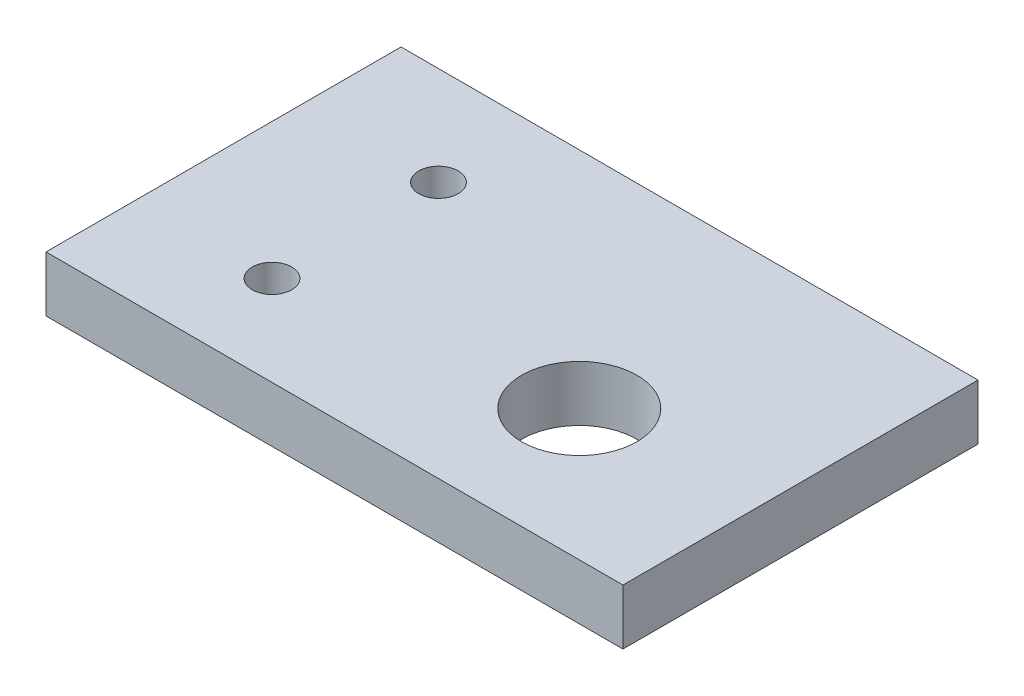
ISO-10303-21;
HEADER;
FILE_DESCRIPTION(('STEP AP214'),'2;1');
FILE_NAME('part.step','',(''),(''),'','','');
FILE_SCHEMA(('AUTOMOTIVE_DESIGN { 1 0 10303 214 1 1 1 1 }'));
ENDSEC;
DATA;
#1=APPLICATION_CONTEXT('core data for automotive mechanical design processes');
#2=APPLICATION_PROTOCOL_DEFINITION('international standard','automotive_design',2000,#1);
#3=PRODUCT_CONTEXT('',#1,'mechanical');
#4=PRODUCT('Part','Part','',(#3));
#5=PRODUCT_RELATED_PRODUCT_CATEGORY('part','',(#4));
#6=PRODUCT_DEFINITION_FORMATION('','',#4);
#7=PRODUCT_DEFINITION_CONTEXT('part definition',#1,'design');
#8=PRODUCT_DEFINITION('design','',#6,#7);
#9=PRODUCT_DEFINITION_SHAPE('','',#8);
#10=(LENGTH_UNIT() NAMED_UNIT(*) SI_UNIT(.MILLI.,.METRE.));
#11=(NAMED_UNIT(*) PLANE_ANGLE_UNIT() SI_UNIT($,.RADIAN.));
#12=(NAMED_UNIT(*) SI_UNIT($,.STERADIAN.) SOLID_ANGLE_UNIT());
#13=UNCERTAINTY_MEASURE_WITH_UNIT(LENGTH_MEASURE(1.E-05),#10,'distance_accuracy_value','');
#14=(GEOMETRIC_REPRESENTATION_CONTEXT(3) GLOBAL_UNCERTAINTY_ASSIGNED_CONTEXT((#13)) GLOBAL_UNIT_ASSIGNED_CONTEXT((#10,
#11,#12)) REPRESENTATION_CONTEXT('',''));
#15=CARTESIAN_POINT('',(0.,0.,0.));
#16=DIRECTION('',(0.,0.,1.));
#17=DIRECTION('',(1.,0.,0.));
#18=AXIS2_PLACEMENT_3D('',#15,#16,#17);
#19=CARTESIAN_POINT('',(0.,3.175,0.));
#20=DIRECTION('',(-1.,0.,0.));
#21=DIRECTION('',(0.,0.,1.));
#22=AXIS2_PLACEMENT_3D('',#19,#20,#21);
#23=PLANE('',#22);
#24=DIRECTION('',(0.,0.,-1.));
#25=VECTOR('',#24,1.);
#26=CARTESIAN_POINT('',(0.,0.,0.));
#27=LINE('',#26,#25);
#28=CARTESIAN_POINT('',(0.,0.,0.));
#29=VERTEX_POINT('',#28);
#30=CARTESIAN_POINT('',(0.,0.,-20.32));
#31=VERTEX_POINT('',#30);
#32=EDGE_CURVE('E105',#29,#31,#27,.T.);
#33=ORIENTED_EDGE('',*,*,#32,.F.);
#34=DIRECTION('',(0.,-1.,0.));
#35=VECTOR('',#34,1.);
#36=CARTESIAN_POINT('',(0.,3.175,0.));
#37=LINE('',#36,#35);
#38=CARTESIAN_POINT('',(0.,3.175,0.));
#39=VERTEX_POINT('',#38);
#40=EDGE_CURVE('E11',#39,#29,#37,.T.);
#41=ORIENTED_EDGE('',*,*,#40,.F.);
#42=DIRECTION('',(0.,0.,-1.));
#43=VECTOR('',#42,1.);
#44=CARTESIAN_POINT('',(0.,3.175,0.));
#45=LINE('',#44,#43);
#46=CARTESIAN_POINT('',(0.,3.175,-20.32));
#47=VERTEX_POINT('',#46);
#48=EDGE_CURVE('E89',#39,#47,#45,.T.);
#49=ORIENTED_EDGE('',*,*,#48,.T.);
#50=DIRECTION('',(0.,-1.,0.));
#51=VECTOR('',#50,1.);
#52=CARTESIAN_POINT('',(0.,3.175,-20.32));
#53=LINE('',#52,#51);
#54=EDGE_CURVE('E51',#47,#31,#53,.T.);
#55=ORIENTED_EDGE('',*,*,#54,.T.);
#56=EDGE_LOOP('',(#33,#41,#49,#55));
#57=FACE_BOUND('',#56,.T.);
#58=ADVANCED_FACE('F34',(#57),#23,.T.);
#59=CARTESIAN_POINT('',(0.,3.175,0.));
#60=DIRECTION('',(0.,0.,-1.));
#61=DIRECTION('',(-1.,0.,0.));
#62=AXIS2_PLACEMENT_3D('',#59,#60,#61);
#63=PLANE('',#62);
#64=DIRECTION('',(1.,0.,0.));
#65=VECTOR('',#64,1.);
#66=CARTESIAN_POINT('',(0.,0.,0.));
#67=LINE('',#66,#65);
#68=CARTESIAN_POINT('',(33.02,0.,0.));
#69=VERTEX_POINT('',#68);
#70=EDGE_CURVE('E94',#29,#69,#67,.T.);
#71=ORIENTED_EDGE('',*,*,#70,.T.);
#72=DIRECTION('',(0.,-1.,0.));
#73=VECTOR('',#72,1.);
#74=CARTESIAN_POINT('',(33.02,3.175,0.));
#75=LINE('',#74,#73);
#76=CARTESIAN_POINT('',(33.02,3.175,0.));
#77=VERTEX_POINT('',#76);
#78=EDGE_CURVE('E43',#77,#69,#75,.T.);
#79=ORIENTED_EDGE('',*,*,#78,.F.);
#80=DIRECTION('',(1.,0.,0.));
#81=VECTOR('',#80,1.);
#82=CARTESIAN_POINT('',(0.,3.175,0.));
#83=LINE('',#82,#81);
#84=EDGE_CURVE('E85',#39,#77,#83,.T.);
#85=ORIENTED_EDGE('',*,*,#84,.F.);
#86=ORIENTED_EDGE('',*,*,#40,.T.);
#87=EDGE_LOOP('',(#71,#79,#85,#86));
#88=FACE_BOUND('',#87,.T.);
#89=ADVANCED_FACE('F92',(#88),#63,.F.);
#90=CARTESIAN_POINT('',(33.02,3.175,0.));
#91=DIRECTION('',(-1.,0.,0.));
#92=DIRECTION('',(0.,0.,1.));
#93=AXIS2_PLACEMENT_3D('',#90,#91,#92);
#94=PLANE('',#93);
#95=DIRECTION('',(0.,0.,-1.));
#96=VECTOR('',#95,1.);
#97=CARTESIAN_POINT('',(33.02,0.,0.));
#98=LINE('',#97,#96);
#99=CARTESIAN_POINT('',(33.02,0.,-20.32));
#100=VERTEX_POINT('',#99);
#101=EDGE_CURVE('E102',#69,#100,#98,.T.);
#102=ORIENTED_EDGE('',*,*,#101,.T.);
#103=DIRECTION('',(0.,-1.,0.));
#104=VECTOR('',#103,1.);
#105=CARTESIAN_POINT('',(33.02,3.175,-20.32));
#106=LINE('',#105,#104);
#107=CARTESIAN_POINT('',(33.02,3.175,-20.32));
#108=VERTEX_POINT('',#107);
#109=EDGE_CURVE('E65',#108,#100,#106,.T.);
#110=ORIENTED_EDGE('',*,*,#109,.F.);
#111=DIRECTION('',(0.,0.,-1.));
#112=VECTOR('',#111,1.);
#113=CARTESIAN_POINT('',(33.02,3.175,0.));
#114=LINE('',#113,#112);
#115=EDGE_CURVE('E77',#77,#108,#114,.T.);
#116=ORIENTED_EDGE('',*,*,#115,.F.);
#117=ORIENTED_EDGE('',*,*,#78,.T.);
#118=EDGE_LOOP('',(#102,#110,#116,#117));
#119=FACE_BOUND('',#118,.T.);
#120=ADVANCED_FACE('F79',(#119),#94,.F.);
#121=CARTESIAN_POINT('',(23.02,3.175,-7.5));
#122=DIRECTION('',(0.,-1.,0.));
#123=DIRECTION('',(0.,0.,-1.));
#124=AXIS2_PLACEMENT_3D('',#121,#122,#123);
#125=CYLINDRICAL_SURFACE('',#124,3.30000000000001);
#126=CARTESIAN_POINT('',(23.02,3.175,-7.5));
#127=DIRECTION('',(0.,1.,0.));
#128=DIRECTION('',(0.,0.,1.));
#129=AXIS2_PLACEMENT_3D('',#126,#127,#128);
#130=CIRCLE('',#129,3.30000000000001);
#131=CARTESIAN_POINT('',(23.02,3.175,-4.19999999999999));
#132=VERTEX_POINT('',#131);
#133=EDGE_CURVE('E101',#132,#132,#130,.T.);
#134=ORIENTED_EDGE('',*,*,#133,.T.);
#135=EDGE_LOOP('',(#134));
#136=FACE_BOUND('',#135,.T.);
#137=CARTESIAN_POINT('',(23.02,0.,-7.5));
#138=DIRECTION('',(0.,1.,0.));
#139=DIRECTION('',(0.,0.,1.));
#140=AXIS2_PLACEMENT_3D('',#137,#138,#139);
#141=CIRCLE('',#140,3.30000000000001);
#142=CARTESIAN_POINT('',(23.02,0.,-4.19999999999999));
#143=VERTEX_POINT('',#142);
#144=EDGE_CURVE('E107',#143,#143,#141,.T.);
#145=ORIENTED_EDGE('',*,*,#144,.F.);
#146=EDGE_LOOP('',(#145));
#147=FACE_BOUND('',#146,.T.);
#148=ADVANCED_FACE('F36',(#136,#147),#125,.F.);
#149=CARTESIAN_POINT('',(0.,3.175,-20.32));
#150=DIRECTION('',(0.,0.,-1.));
#151=DIRECTION('',(-1.,0.,0.));
#152=AXIS2_PLACEMENT_3D('',#149,#150,#151);
#153=PLANE('',#152);
#154=DIRECTION('',(1.,0.,0.));
#155=VECTOR('',#154,1.);
#156=CARTESIAN_POINT('',(0.,0.,-20.32));
#157=LINE('',#156,#155);
#158=EDGE_CURVE('E98',#31,#100,#157,.T.);
#159=ORIENTED_EDGE('',*,*,#158,.F.);
#160=ORIENTED_EDGE('',*,*,#54,.F.);
#161=DIRECTION('',(1.,0.,0.));
#162=VECTOR('',#161,1.);
#163=CARTESIAN_POINT('',(0.,3.175,-20.32));
#164=LINE('',#163,#162);
#165=EDGE_CURVE('E84',#47,#108,#164,.T.);
#166=ORIENTED_EDGE('',*,*,#165,.T.);
#167=ORIENTED_EDGE('',*,*,#109,.T.);
#168=EDGE_LOOP('',(#159,#160,#166,#167));
#169=FACE_BOUND('',#168,.T.);
#170=ADVANCED_FACE('F139',(#169),#153,.T.);
#171=CARTESIAN_POINT('',(0.,3.175,0.));
#172=DIRECTION('',(0.,1.,0.));
#173=DIRECTION('',(0.,0.,1.));
#174=AXIS2_PLACEMENT_3D('',#171,#172,#173);
#175=PLANE('',#174);
#176=CARTESIAN_POINT('',(7.78000000000001,3.175,-14.6812));
#177=DIRECTION('',(0.,1.,0.));
#178=DIRECTION('',(0.,0.,1.));
#179=AXIS2_PLACEMENT_3D('',#176,#177,#178);
#180=CIRCLE('',#179,1.1303);
#181=CARTESIAN_POINT('',(7.78000000000001,3.175,-13.5509));
#182=VERTEX_POINT('',#181);
#183=EDGE_CURVE('E121',#182,#182,#180,.T.);
#184=ORIENTED_EDGE('',*,*,#183,.F.);
#185=EDGE_LOOP('',(#184));
#186=FACE_BOUND('',#185,.T.);
#187=CARTESIAN_POINT('',(7.78000000000001,3.175,-5.1562));
#188=DIRECTION('',(0.,1.,0.));
#189=DIRECTION('',(0.,0.,1.));
#190=AXIS2_PLACEMENT_3D('',#187,#188,#189);
#191=CIRCLE('',#190,1.1303);
#192=CARTESIAN_POINT('',(7.78000000000001,3.175,-4.0259));
#193=VERTEX_POINT('',#192);
#194=EDGE_CURVE('E115',#193,#193,#191,.T.);
#195=ORIENTED_EDGE('',*,*,#194,.F.);
#196=EDGE_LOOP('',(#195));
#197=FACE_BOUND('',#196,.T.);
#198=ORIENTED_EDGE('',*,*,#133,.F.);
#199=EDGE_LOOP('',(#198));
#200=FACE_BOUND('',#199,.T.);
#201=ORIENTED_EDGE('',*,*,#48,.F.);
#202=ORIENTED_EDGE('',*,*,#84,.T.);
#203=ORIENTED_EDGE('',*,*,#115,.T.);
#204=ORIENTED_EDGE('',*,*,#165,.F.);
#205=EDGE_LOOP('',(#201,#202,#203,#204));
#206=FACE_BOUND('',#205,.T.);
#207=ADVANCED_FACE('F88',(#186,#197,#200,#206),#175,.T.);
#208=CARTESIAN_POINT('',(0.,0.,0.));
#209=DIRECTION('',(0.,1.,0.));
#210=DIRECTION('',(0.,0.,1.));
#211=AXIS2_PLACEMENT_3D('',#208,#209,#210);
#212=PLANE('',#211);
#213=CARTESIAN_POINT('',(7.78000000000001,0.,-14.6812));
#214=DIRECTION('',(0.,1.,0.));
#215=DIRECTION('',(0.,0.,1.));
#216=AXIS2_PLACEMENT_3D('',#213,#214,#215);
#217=CIRCLE('',#216,1.1303);
#218=CARTESIAN_POINT('',(7.78000000000001,0.,-13.5509));
#219=VERTEX_POINT('',#218);
#220=EDGE_CURVE('E118',#219,#219,#217,.T.);
#221=ORIENTED_EDGE('',*,*,#220,.T.);
#222=EDGE_LOOP('',(#221));
#223=FACE_BOUND('',#222,.T.);
#224=CARTESIAN_POINT('',(7.78000000000001,0.,-5.1562));
#225=DIRECTION('',(0.,1.,0.));
#226=DIRECTION('',(0.,0.,1.));
#227=AXIS2_PLACEMENT_3D('',#224,#225,#226);
#228=CIRCLE('',#227,1.1303);
#229=CARTESIAN_POINT('',(7.78000000000001,0.,-4.0259));
#230=VERTEX_POINT('',#229);
#231=EDGE_CURVE('E110',#230,#230,#228,.T.);
#232=ORIENTED_EDGE('',*,*,#231,.T.);
#233=EDGE_LOOP('',(#232));
#234=FACE_BOUND('',#233,.T.);
#235=ORIENTED_EDGE('',*,*,#144,.T.);
#236=EDGE_LOOP('',(#235));
#237=FACE_BOUND('',#236,.T.);
#238=ORIENTED_EDGE('',*,*,#32,.T.);
#239=ORIENTED_EDGE('',*,*,#158,.T.);
#240=ORIENTED_EDGE('',*,*,#101,.F.);
#241=ORIENTED_EDGE('',*,*,#70,.F.);
#242=EDGE_LOOP('',(#238,#239,#240,#241));
#243=FACE_BOUND('',#242,.T.);
#244=ADVANCED_FACE('F127',(#223,#234,#237,#243),#212,.F.);
#245=CARTESIAN_POINT('',(7.78000000000001,0.,-5.1562));
#246=DIRECTION('',(0.,1.,0.));
#247=DIRECTION('',(0.,0.,1.));
#248=AXIS2_PLACEMENT_3D('',#245,#246,#247);
#249=CYLINDRICAL_SURFACE('',#248,1.1303);
#250=ORIENTED_EDGE('',*,*,#231,.F.);
#251=EDGE_LOOP('',(#250));
#252=FACE_BOUND('',#251,.T.);
#253=ORIENTED_EDGE('',*,*,#194,.T.);
#254=EDGE_LOOP('',(#253));
#255=FACE_BOUND('',#254,.T.);
#256=ADVANCED_FACE('F133',(#252,#255),#249,.F.);
#257=CARTESIAN_POINT('',(7.78000000000001,0.,-14.6812));
#258=DIRECTION('',(0.,1.,0.));
#259=DIRECTION('',(0.,0.,1.));
#260=AXIS2_PLACEMENT_3D('',#257,#258,#259);
#261=CYLINDRICAL_SURFACE('',#260,1.1303);
#262=ORIENTED_EDGE('',*,*,#220,.F.);
#263=EDGE_LOOP('',(#262));
#264=FACE_BOUND('',#263,.T.);
#265=ORIENTED_EDGE('',*,*,#183,.T.);
#266=EDGE_LOOP('',(#265));
#267=FACE_BOUND('',#266,.T.);
#268=ADVANCED_FACE('F130',(#264,#267),#261,.F.);
#269=CLOSED_SHELL('',(#58,#89,#120,#148,#170,#207,#244,#256,#268));
#270=MANIFOLD_SOLID_BREP('B2',#269);
#271=ADVANCED_BREP_SHAPE_REPRESENTATION('',(#18,#270),#14);
#272=SHAPE_DEFINITION_REPRESENTATION(#9,#271);
ENDSEC;
END-ISO-10303-21;
